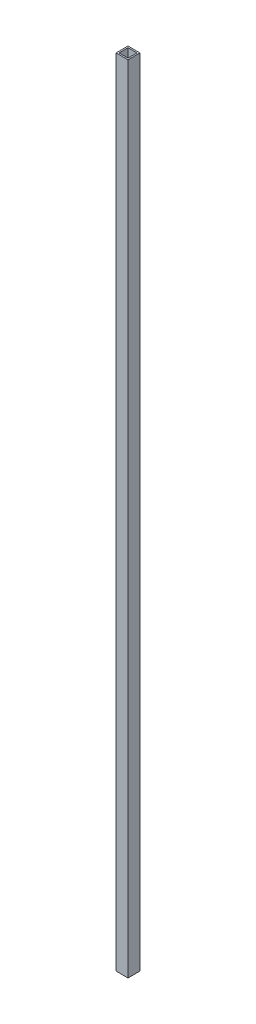
ISO-10303-21;
HEADER;
FILE_DESCRIPTION(('STEP AP214'),'2;1');
FILE_NAME('part.step','',(''),(''),'','','');
FILE_SCHEMA(('AUTOMOTIVE_DESIGN { 1 0 10303 214 1 1 1 1 }'));
ENDSEC;
DATA;
#1=APPLICATION_CONTEXT('core data for automotive mechanical design processes');
#2=APPLICATION_PROTOCOL_DEFINITION('international standard','automotive_design',2000,#1);
#3=PRODUCT_CONTEXT('',#1,'mechanical');
#4=PRODUCT('Part','Part','',(#3));
#5=PRODUCT_RELATED_PRODUCT_CATEGORY('part','',(#4));
#6=PRODUCT_DEFINITION_FORMATION('','',#4);
#7=PRODUCT_DEFINITION_CONTEXT('part definition',#1,'design');
#8=PRODUCT_DEFINITION('design','',#6,#7);
#9=PRODUCT_DEFINITION_SHAPE('','',#8);
#10=(LENGTH_UNIT() NAMED_UNIT(*) SI_UNIT(.MILLI.,.METRE.));
#11=(NAMED_UNIT(*) PLANE_ANGLE_UNIT() SI_UNIT($,.RADIAN.));
#12=(NAMED_UNIT(*) SI_UNIT($,.STERADIAN.) SOLID_ANGLE_UNIT());
#13=UNCERTAINTY_MEASURE_WITH_UNIT(LENGTH_MEASURE(1.E-05),#10,'distance_accuracy_value','');
#14=(GEOMETRIC_REPRESENTATION_CONTEXT(3) GLOBAL_UNCERTAINTY_ASSIGNED_CONTEXT((#13)) GLOBAL_UNIT_ASSIGNED_CONTEXT((#10,
#11,#12)) REPRESENTATION_CONTEXT('',''));
#15=CARTESIAN_POINT('',(0.,0.,0.));
#16=DIRECTION('',(0.,0.,1.));
#17=DIRECTION('',(1.,0.,0.));
#18=AXIS2_PLACEMENT_3D('',#15,#16,#17);
#19=CARTESIAN_POINT('',(0.,845.,0.));
#20=DIRECTION('',(0.,-1.,0.));
#21=DIRECTION('',(0.,0.,-1.));
#22=AXIS2_PLACEMENT_3D('',#19,#20,#21);
#23=PLANE('',#22);
#24=DIRECTION('',(0.,0.,1.));
#25=VECTOR('',#24,1.);
#26=CARTESIAN_POINT('',(-6.35,845.,-6.35));
#27=LINE('',#26,#25);
#28=CARTESIAN_POINT('',(-6.35,845.,-6.35));
#29=VERTEX_POINT('',#28);
#30=CARTESIAN_POINT('',(-6.35,845.,6.35));
#31=VERTEX_POINT('',#30);
#32=EDGE_CURVE('E135',#29,#31,#27,.T.);
#33=ORIENTED_EDGE('',*,*,#32,.T.);
#34=DIRECTION('',(1.,0.,0.));
#35=VECTOR('',#34,1.);
#36=CARTESIAN_POINT('',(6.35,845.,6.35));
#37=LINE('',#36,#35);
#38=CARTESIAN_POINT('',(6.35,845.,6.35));
#39=VERTEX_POINT('',#38);
#40=EDGE_CURVE('E138',#31,#39,#37,.T.);
#41=ORIENTED_EDGE('',*,*,#40,.T.);
#42=DIRECTION('',(0.,0.,-1.));
#43=VECTOR('',#42,1.);
#44=CARTESIAN_POINT('',(6.35,845.,-6.35));
#45=LINE('',#44,#43);
#46=CARTESIAN_POINT('',(6.35,845.,-6.35));
#47=VERTEX_POINT('',#46);
#48=EDGE_CURVE('E141',#39,#47,#45,.T.);
#49=ORIENTED_EDGE('',*,*,#48,.T.);
#50=DIRECTION('',(-1.,0.,0.));
#51=VECTOR('',#50,1.);
#52=CARTESIAN_POINT('',(6.35,845.,-6.35));
#53=LINE('',#52,#51);
#54=EDGE_CURVE('E143',#47,#29,#53,.T.);
#55=ORIENTED_EDGE('',*,*,#54,.T.);
#56=EDGE_LOOP('',(#33,#41,#49,#55));
#57=FACE_BOUND('',#56,.T.);
#58=DIRECTION('',(0.,0.,1.));
#59=VECTOR('',#58,1.);
#60=CARTESIAN_POINT('',(-4.7625,845.,-4.7625));
#61=LINE('',#60,#59);
#62=CARTESIAN_POINT('',(-4.7625,845.,-4.7625));
#63=VERTEX_POINT('',#62);
#64=CARTESIAN_POINT('',(-4.7625,845.,4.7625));
#65=VERTEX_POINT('',#64);
#66=EDGE_CURVE('E99',#63,#65,#61,.T.);
#67=ORIENTED_EDGE('',*,*,#66,.F.);
#68=DIRECTION('',(-1.,0.,0.));
#69=VECTOR('',#68,1.);
#70=CARTESIAN_POINT('',(4.7625,845.,-4.7625));
#71=LINE('',#70,#69);
#72=CARTESIAN_POINT('',(4.7625,845.,-4.7625));
#73=VERTEX_POINT('',#72);
#74=EDGE_CURVE('E121',#73,#63,#71,.T.);
#75=ORIENTED_EDGE('',*,*,#74,.F.);
#76=DIRECTION('',(0.,0.,-1.));
#77=VECTOR('',#76,1.);
#78=CARTESIAN_POINT('',(4.7625,845.,-4.7625));
#79=LINE('',#78,#77);
#80=CARTESIAN_POINT('',(4.7625,845.,4.7625));
#81=VERTEX_POINT('',#80);
#82=EDGE_CURVE('E119',#81,#73,#79,.T.);
#83=ORIENTED_EDGE('',*,*,#82,.F.);
#84=DIRECTION('',(1.,0.,0.));
#85=VECTOR('',#84,1.);
#86=CARTESIAN_POINT('',(4.7625,845.,4.7625));
#87=LINE('',#86,#85);
#88=EDGE_CURVE('E107',#65,#81,#87,.T.);
#89=ORIENTED_EDGE('',*,*,#88,.F.);
#90=EDGE_LOOP('',(#67,#75,#83,#89));
#91=FACE_BOUND('',#90,.T.);
#92=ADVANCED_FACE('F34',(#57,#91),#23,.F.);
#93=CARTESIAN_POINT('',(0.,0.,0.));
#94=DIRECTION('',(0.,-1.,0.));
#95=DIRECTION('',(0.,0.,-1.));
#96=AXIS2_PLACEMENT_3D('',#93,#94,#95);
#97=PLANE('',#96);
#98=DIRECTION('',(0.,0.,1.));
#99=VECTOR('',#98,1.);
#100=CARTESIAN_POINT('',(-6.35,0.,-6.35));
#101=LINE('',#100,#99);
#102=CARTESIAN_POINT('',(-6.35,0.,-6.35));
#103=VERTEX_POINT('',#102);
#104=CARTESIAN_POINT('',(-6.35,0.,6.35));
#105=VERTEX_POINT('',#104);
#106=EDGE_CURVE('E115',#103,#105,#101,.T.);
#107=ORIENTED_EDGE('',*,*,#106,.F.);
#108=DIRECTION('',(-1.,0.,0.));
#109=VECTOR('',#108,1.);
#110=CARTESIAN_POINT('',(6.35,0.,-6.35));
#111=LINE('',#110,#109);
#112=CARTESIAN_POINT('',(6.35,0.,-6.35));
#113=VERTEX_POINT('',#112);
#114=EDGE_CURVE('E139',#113,#103,#111,.T.);
#115=ORIENTED_EDGE('',*,*,#114,.F.);
#116=DIRECTION('',(0.,0.,-1.));
#117=VECTOR('',#116,1.);
#118=CARTESIAN_POINT('',(6.35,0.,-6.35));
#119=LINE('',#118,#117);
#120=CARTESIAN_POINT('',(6.35,0.,6.35));
#121=VERTEX_POINT('',#120);
#122=EDGE_CURVE('E150',#121,#113,#119,.T.);
#123=ORIENTED_EDGE('',*,*,#122,.F.);
#124=DIRECTION('',(1.,0.,0.));
#125=VECTOR('',#124,1.);
#126=CARTESIAN_POINT('',(6.35,0.,6.35));
#127=LINE('',#126,#125);
#128=EDGE_CURVE('E148',#105,#121,#127,.T.);
#129=ORIENTED_EDGE('',*,*,#128,.F.);
#130=EDGE_LOOP('',(#107,#115,#123,#129));
#131=FACE_BOUND('',#130,.T.);
#132=DIRECTION('',(-1.,0.,0.));
#133=VECTOR('',#132,1.);
#134=CARTESIAN_POINT('',(4.7625,0.,-4.7625));
#135=LINE('',#134,#133);
#136=CARTESIAN_POINT('',(4.7625,0.,-4.7625));
#137=VERTEX_POINT('',#136);
#138=CARTESIAN_POINT('',(-4.7625,0.,-4.7625));
#139=VERTEX_POINT('',#138);
#140=EDGE_CURVE('E108',#137,#139,#135,.T.);
#141=ORIENTED_EDGE('',*,*,#140,.T.);
#142=DIRECTION('',(0.,0.,1.));
#143=VECTOR('',#142,1.);
#144=CARTESIAN_POINT('',(-4.7625,0.,-4.7625));
#145=LINE('',#144,#143);
#146=CARTESIAN_POINT('',(-4.7625,0.,4.7625));
#147=VERTEX_POINT('',#146);
#148=EDGE_CURVE('E57',#139,#147,#145,.T.);
#149=ORIENTED_EDGE('',*,*,#148,.T.);
#150=DIRECTION('',(1.,0.,0.));
#151=VECTOR('',#150,1.);
#152=CARTESIAN_POINT('',(4.7625,0.,4.7625));
#153=LINE('',#152,#151);
#154=CARTESIAN_POINT('',(4.7625,0.,4.7625));
#155=VERTEX_POINT('',#154);
#156=EDGE_CURVE('E114',#147,#155,#153,.T.);
#157=ORIENTED_EDGE('',*,*,#156,.T.);
#158=DIRECTION('',(0.,0.,-1.));
#159=VECTOR('',#158,1.);
#160=CARTESIAN_POINT('',(4.7625,0.,-4.7625));
#161=LINE('',#160,#159);
#162=EDGE_CURVE('E127',#155,#137,#161,.T.);
#163=ORIENTED_EDGE('',*,*,#162,.T.);
#164=EDGE_LOOP('',(#141,#149,#157,#163));
#165=FACE_BOUND('',#164,.T.);
#166=ADVANCED_FACE('F168',(#131,#165),#97,.T.);
#167=CARTESIAN_POINT('',(-6.35,845.,-6.35));
#168=DIRECTION('',(1.,0.,0.));
#169=DIRECTION('',(0.,0.,-1.));
#170=AXIS2_PLACEMENT_3D('',#167,#168,#169);
#171=PLANE('',#170);
#172=ORIENTED_EDGE('',*,*,#106,.T.);
#173=DIRECTION('',(0.,-1.,0.));
#174=VECTOR('',#173,1.);
#175=CARTESIAN_POINT('',(-6.35,845.,6.35));
#176=LINE('',#175,#174);
#177=EDGE_CURVE('E11',#31,#105,#176,.T.);
#178=ORIENTED_EDGE('',*,*,#177,.F.);
#179=ORIENTED_EDGE('',*,*,#32,.F.);
#180=DIRECTION('',(0.,-1.,0.));
#181=VECTOR('',#180,1.);
#182=CARTESIAN_POINT('',(-6.35,845.,-6.35));
#183=LINE('',#182,#181);
#184=EDGE_CURVE('E145',#29,#103,#183,.T.);
#185=ORIENTED_EDGE('',*,*,#184,.T.);
#186=EDGE_LOOP('',(#172,#178,#179,#185));
#187=FACE_BOUND('',#186,.T.);
#188=ADVANCED_FACE('F36',(#187),#171,.F.);
#189=CARTESIAN_POINT('',(6.35,845.,6.35));
#190=DIRECTION('',(0.,0.,-1.));
#191=DIRECTION('',(-1.,0.,0.));
#192=AXIS2_PLACEMENT_3D('',#189,#190,#191);
#193=PLANE('',#192);
#194=ORIENTED_EDGE('',*,*,#128,.T.);
#195=DIRECTION('',(0.,-1.,0.));
#196=VECTOR('',#195,1.);
#197=CARTESIAN_POINT('',(6.35,845.,6.35));
#198=LINE('',#197,#196);
#199=EDGE_CURVE('E42',#39,#121,#198,.T.);
#200=ORIENTED_EDGE('',*,*,#199,.F.);
#201=ORIENTED_EDGE('',*,*,#40,.F.);
#202=ORIENTED_EDGE('',*,*,#177,.T.);
#203=EDGE_LOOP('',(#194,#200,#201,#202));
#204=FACE_BOUND('',#203,.T.);
#205=ADVANCED_FACE('F178',(#204),#193,.F.);
#206=CARTESIAN_POINT('',(6.35,845.,-6.35));
#207=DIRECTION('',(-1.,0.,0.));
#208=DIRECTION('',(0.,0.,1.));
#209=AXIS2_PLACEMENT_3D('',#206,#207,#208);
#210=PLANE('',#209);
#211=ORIENTED_EDGE('',*,*,#122,.T.);
#212=DIRECTION('',(0.,-1.,0.));
#213=VECTOR('',#212,1.);
#214=CARTESIAN_POINT('',(6.35,845.,-6.35));
#215=LINE('',#214,#213);
#216=EDGE_CURVE('E155',#47,#113,#215,.T.);
#217=ORIENTED_EDGE('',*,*,#216,.F.);
#218=ORIENTED_EDGE('',*,*,#48,.F.);
#219=ORIENTED_EDGE('',*,*,#199,.T.);
#220=EDGE_LOOP('',(#211,#217,#218,#219));
#221=FACE_BOUND('',#220,.T.);
#222=ADVANCED_FACE('F162',(#221),#210,.F.);
#223=CARTESIAN_POINT('',(6.35,845.,-6.35));
#224=DIRECTION('',(0.,0.,1.));
#225=DIRECTION('',(1.,0.,0.));
#226=AXIS2_PLACEMENT_3D('',#223,#224,#225);
#227=PLANE('',#226);
#228=ORIENTED_EDGE('',*,*,#114,.T.);
#229=ORIENTED_EDGE('',*,*,#184,.F.);
#230=ORIENTED_EDGE('',*,*,#54,.F.);
#231=ORIENTED_EDGE('',*,*,#216,.T.);
#232=EDGE_LOOP('',(#228,#229,#230,#231));
#233=FACE_BOUND('',#232,.T.);
#234=ADVANCED_FACE('F172',(#233),#227,.F.);
#235=CARTESIAN_POINT('',(-4.7625,845.,-4.7625));
#236=DIRECTION('',(1.,0.,0.));
#237=DIRECTION('',(0.,0.,-1.));
#238=AXIS2_PLACEMENT_3D('',#235,#236,#237);
#239=PLANE('',#238);
#240=ORIENTED_EDGE('',*,*,#148,.F.);
#241=DIRECTION('',(0.,-1.,0.));
#242=VECTOR('',#241,1.);
#243=CARTESIAN_POINT('',(-4.7625,845.,-4.7625));
#244=LINE('',#243,#242);
#245=EDGE_CURVE('E103',#63,#139,#244,.T.);
#246=ORIENTED_EDGE('',*,*,#245,.F.);
#247=ORIENTED_EDGE('',*,*,#66,.T.);
#248=DIRECTION('',(0.,-1.,0.));
#249=VECTOR('',#248,1.);
#250=CARTESIAN_POINT('',(-4.7625,845.,4.7625));
#251=LINE('',#250,#249);
#252=EDGE_CURVE('E102',#65,#147,#251,.T.);
#253=ORIENTED_EDGE('',*,*,#252,.T.);
#254=EDGE_LOOP('',(#240,#246,#247,#253));
#255=FACE_BOUND('',#254,.T.);
#256=ADVANCED_FACE('F101',(#255),#239,.T.);
#257=CARTESIAN_POINT('',(4.7625,845.,4.7625));
#258=DIRECTION('',(0.,0.,-1.));
#259=DIRECTION('',(-1.,0.,0.));
#260=AXIS2_PLACEMENT_3D('',#257,#258,#259);
#261=PLANE('',#260);
#262=ORIENTED_EDGE('',*,*,#156,.F.);
#263=ORIENTED_EDGE('',*,*,#252,.F.);
#264=ORIENTED_EDGE('',*,*,#88,.T.);
#265=DIRECTION('',(0.,-1.,0.));
#266=VECTOR('',#265,1.);
#267=CARTESIAN_POINT('',(4.7625,845.,4.7625));
#268=LINE('',#267,#266);
#269=EDGE_CURVE('E116',#81,#155,#268,.T.);
#270=ORIENTED_EDGE('',*,*,#269,.T.);
#271=EDGE_LOOP('',(#262,#263,#264,#270));
#272=FACE_BOUND('',#271,.T.);
#273=ADVANCED_FACE('F111',(#272),#261,.T.);
#274=CARTESIAN_POINT('',(4.7625,845.,-4.7625));
#275=DIRECTION('',(-1.,0.,0.));
#276=DIRECTION('',(0.,0.,1.));
#277=AXIS2_PLACEMENT_3D('',#274,#275,#276);
#278=PLANE('',#277);
#279=ORIENTED_EDGE('',*,*,#162,.F.);
#280=ORIENTED_EDGE('',*,*,#269,.F.);
#281=ORIENTED_EDGE('',*,*,#82,.T.);
#282=DIRECTION('',(0.,-1.,0.));
#283=VECTOR('',#282,1.);
#284=CARTESIAN_POINT('',(4.7625,845.,-4.7625));
#285=LINE('',#284,#283);
#286=EDGE_CURVE('E49',#73,#137,#285,.T.);
#287=ORIENTED_EDGE('',*,*,#286,.T.);
#288=EDGE_LOOP('',(#279,#280,#281,#287));
#289=FACE_BOUND('',#288,.T.);
#290=ADVANCED_FACE('F201',(#289),#278,.T.);
#291=CARTESIAN_POINT('',(4.7625,845.,-4.7625));
#292=DIRECTION('',(0.,0.,1.));
#293=DIRECTION('',(1.,0.,0.));
#294=AXIS2_PLACEMENT_3D('',#291,#292,#293);
#295=PLANE('',#294);
#296=ORIENTED_EDGE('',*,*,#140,.F.);
#297=ORIENTED_EDGE('',*,*,#286,.F.);
#298=ORIENTED_EDGE('',*,*,#74,.T.);
#299=ORIENTED_EDGE('',*,*,#245,.T.);
#300=EDGE_LOOP('',(#296,#297,#298,#299));
#301=FACE_BOUND('',#300,.T.);
#302=ADVANCED_FACE('F205',(#301),#295,.T.);
#303=CLOSED_SHELL('',(#92,#166,#188,#205,#222,#234,#256,#273,#290,#302));
#304=MANIFOLD_SOLID_BREP('B2',#303);
#305=ADVANCED_BREP_SHAPE_REPRESENTATION('',(#18,#304),#14);
#306=SHAPE_DEFINITION_REPRESENTATION(#9,#305);
ENDSEC;
END-ISO-10303-21;
